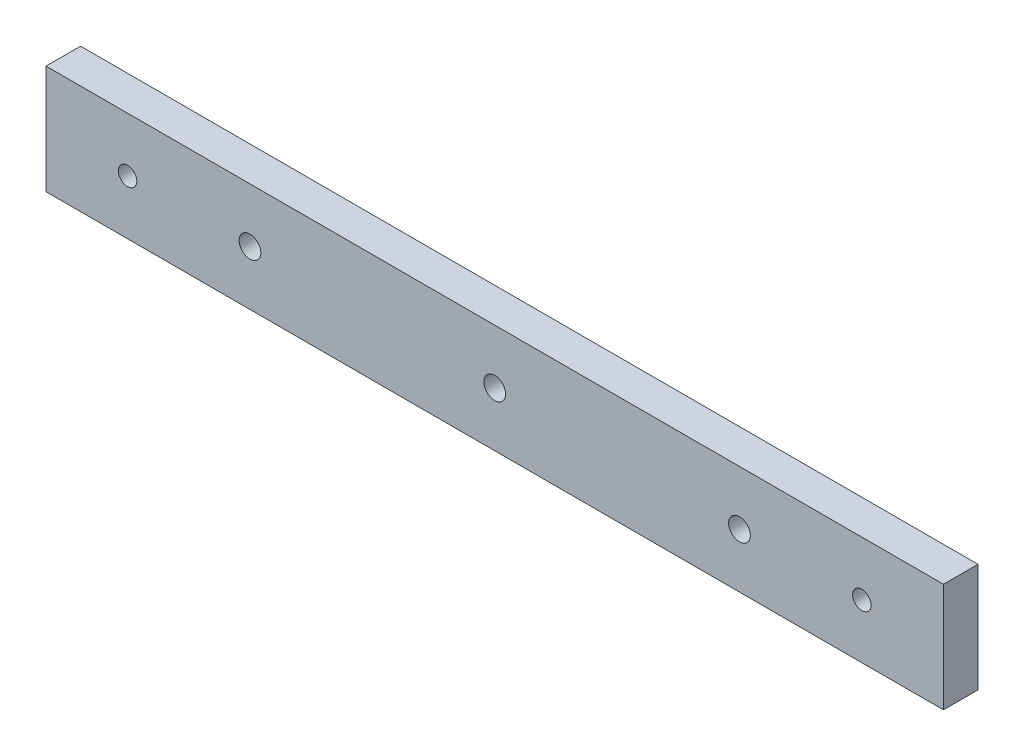
ISO-10303-21;
HEADER;
FILE_DESCRIPTION(('STEP AP214'),'2;1');
FILE_NAME('part.step','',(''),(''),'','','');
FILE_SCHEMA(('AUTOMOTIVE_DESIGN { 1 0 10303 214 1 1 1 1 }'));
ENDSEC;
DATA;
#1=APPLICATION_CONTEXT('core data for automotive mechanical design processes');
#2=APPLICATION_PROTOCOL_DEFINITION('international standard','automotive_design',2000,#1);
#3=PRODUCT_CONTEXT('',#1,'mechanical');
#4=PRODUCT('Part','Part','',(#3));
#5=PRODUCT_RELATED_PRODUCT_CATEGORY('part','',(#4));
#6=PRODUCT_DEFINITION_FORMATION('','',#4);
#7=PRODUCT_DEFINITION_CONTEXT('part definition',#1,'design');
#8=PRODUCT_DEFINITION('design','',#6,#7);
#9=PRODUCT_DEFINITION_SHAPE('','',#8);
#10=(LENGTH_UNIT() NAMED_UNIT(*) SI_UNIT(.MILLI.,.METRE.));
#11=(NAMED_UNIT(*) PLANE_ANGLE_UNIT() SI_UNIT($,.RADIAN.));
#12=(NAMED_UNIT(*) SI_UNIT($,.STERADIAN.) SOLID_ANGLE_UNIT());
#13=UNCERTAINTY_MEASURE_WITH_UNIT(LENGTH_MEASURE(1.E-05),#10,'distance_accuracy_value','');
#14=(GEOMETRIC_REPRESENTATION_CONTEXT(3) GLOBAL_UNCERTAINTY_ASSIGNED_CONTEXT((#13)) GLOBAL_UNIT_ASSIGNED_CONTEXT((#10,
#11,#12)) REPRESENTATION_CONTEXT('',''));
#15=CARTESIAN_POINT('',(0.,0.,0.));
#16=DIRECTION('',(0.,0.,1.));
#17=DIRECTION('',(1.,0.,0.));
#18=AXIS2_PLACEMENT_3D('',#15,#16,#17);
#19=CARTESIAN_POINT('',(29.5476930648458,0.,6.35));
#20=DIRECTION('',(1.,0.,0.));
#21=DIRECTION('',(0.,1.,0.));
#22=AXIS2_PLACEMENT_3D('',#19,#20,#21);
#23=PLANE('',#22);
#24=DIRECTION('',(0.,-1.,0.));
#25=VECTOR('',#24,1.);
#26=CARTESIAN_POINT('',(29.5476930648458,0.,0.));
#27=LINE('',#26,#25);
#28=CARTESIAN_POINT('',(29.5476930648458,-2.57538448919228,0.));
#29=VERTEX_POINT('',#28);
#30=CARTESIAN_POINT('',(29.5476930648458,-22.5753844891923,0.));
#31=VERTEX_POINT('',#30);
#32=EDGE_CURVE('E272',#29,#31,#27,.T.);
#33=ORIENTED_EDGE('',*,*,#32,.F.);
#34=DIRECTION('',(0.,0.,-1.));
#35=VECTOR('',#34,1.);
#36=CARTESIAN_POINT('',(29.5476930648458,-2.57538448919228,6.35));
#37=LINE('',#36,#35);
#38=CARTESIAN_POINT('',(29.5476930648458,-2.57538448919228,6.35));
#39=VERTEX_POINT('',#38);
#40=EDGE_CURVE('E11',#39,#29,#37,.T.);
#41=ORIENTED_EDGE('',*,*,#40,.F.);
#42=DIRECTION('',(0.,-1.,0.));
#43=VECTOR('',#42,1.);
#44=CARTESIAN_POINT('',(29.5476930648458,0.,6.35));
#45=LINE('',#44,#43);
#46=CARTESIAN_POINT('',(29.5476930648458,-22.5753844891923,6.35));
#47=VERTEX_POINT('',#46);
#48=EDGE_CURVE('E255',#39,#47,#45,.T.);
#49=ORIENTED_EDGE('',*,*,#48,.T.);
#50=DIRECTION('',(0.,0.,-1.));
#51=VECTOR('',#50,1.);
#52=CARTESIAN_POINT('',(29.5476930648458,-22.5753844891923,6.35));
#53=LINE('',#52,#51);
#54=EDGE_CURVE('E266',#47,#31,#53,.T.);
#55=ORIENTED_EDGE('',*,*,#54,.T.);
#56=EDGE_LOOP('',(#33,#41,#49,#55));
#57=FACE_BOUND('',#56,.T.);
#58=ADVANCED_FACE('F34',(#57),#23,.T.);
#59=CARTESIAN_POINT('',(0.,-2.57538448919228,6.35));
#60=DIRECTION('',(0.,1.,0.));
#61=DIRECTION('',(-1.,0.,0.));
#62=AXIS2_PLACEMENT_3D('',#59,#60,#61);
#63=PLANE('',#62);
#64=DIRECTION('',(1.,0.,0.));
#65=VECTOR('',#64,1.);
#66=CARTESIAN_POINT('',(0.,-2.57538448919228,0.));
#67=LINE('',#66,#65);
#68=CARTESIAN_POINT('',(-135.452306935154,-2.57538448919231,0.));
#69=VERTEX_POINT('',#68);
#70=EDGE_CURVE('E275',#69,#29,#67,.T.);
#71=ORIENTED_EDGE('',*,*,#70,.F.);
#72=DIRECTION('',(0.,0.,-1.));
#73=VECTOR('',#72,1.);
#74=CARTESIAN_POINT('',(-135.452306935154,-2.57538448919231,6.35));
#75=LINE('',#74,#73);
#76=CARTESIAN_POINT('',(-135.452306935154,-2.57538448919231,6.35));
#77=VERTEX_POINT('',#76);
#78=EDGE_CURVE('E42',#77,#69,#75,.T.);
#79=ORIENTED_EDGE('',*,*,#78,.F.);
#80=DIRECTION('',(1.,0.,0.));
#81=VECTOR('',#80,1.);
#82=CARTESIAN_POINT('',(0.,-2.57538448919228,6.35));
#83=LINE('',#82,#81);
#84=EDGE_CURVE('E258',#77,#39,#83,.T.);
#85=ORIENTED_EDGE('',*,*,#84,.T.);
#86=ORIENTED_EDGE('',*,*,#40,.T.);
#87=EDGE_LOOP('',(#71,#79,#85,#86));
#88=FACE_BOUND('',#87,.T.);
#89=ADVANCED_FACE('F296',(#88),#63,.T.);
#90=CARTESIAN_POINT('',(-135.452306935154,0.,6.35));
#91=DIRECTION('',(1.,0.,0.));
#92=DIRECTION('',(0.,0.,-1.));
#93=AXIS2_PLACEMENT_3D('',#90,#91,#92);
#94=PLANE('',#93);
#95=DIRECTION('',(0.,-1.,0.));
#96=VECTOR('',#95,1.);
#97=CARTESIAN_POINT('',(-135.452306935154,0.,0.));
#98=LINE('',#97,#96);
#99=CARTESIAN_POINT('',(-135.452306935154,-22.5753844891923,0.));
#100=VERTEX_POINT('',#99);
#101=EDGE_CURVE('E278',#69,#100,#98,.T.);
#102=ORIENTED_EDGE('',*,*,#101,.T.);
#103=DIRECTION('',(0.,0.,-1.));
#104=VECTOR('',#103,1.);
#105=CARTESIAN_POINT('',(-135.452306935154,-22.5753844891923,6.35));
#106=LINE('',#105,#104);
#107=CARTESIAN_POINT('',(-135.452306935154,-22.5753844891923,6.35));
#108=VERTEX_POINT('',#107);
#109=EDGE_CURVE('E284',#108,#100,#106,.T.);
#110=ORIENTED_EDGE('',*,*,#109,.F.);
#111=DIRECTION('',(0.,-1.,0.));
#112=VECTOR('',#111,1.);
#113=CARTESIAN_POINT('',(-135.452306935154,0.,6.35));
#114=LINE('',#113,#112);
#115=EDGE_CURVE('E261',#77,#108,#114,.T.);
#116=ORIENTED_EDGE('',*,*,#115,.F.);
#117=ORIENTED_EDGE('',*,*,#78,.T.);
#118=EDGE_LOOP('',(#102,#110,#116,#117));
#119=FACE_BOUND('',#118,.T.);
#120=ADVANCED_FACE('F289',(#119),#94,.F.);
#121=CARTESIAN_POINT('',(14.5476930648458,-12.5753844891923,6.35));
#122=DIRECTION('',(0.,0.,-1.));
#123=DIRECTION('',(-1.,0.,0.));
#124=AXIS2_PLACEMENT_3D('',#121,#122,#123);
#125=CYLINDRICAL_SURFACE('',#124,1.7);
#126=CARTESIAN_POINT('',(14.5476930648458,-12.5753844891923,6.35));
#127=DIRECTION('',(0.,0.,1.));
#128=DIRECTION('',(1.,0.,0.));
#129=AXIS2_PLACEMENT_3D('',#126,#127,#128);
#130=CIRCLE('',#129,1.7);
#131=CARTESIAN_POINT('',(16.2476930648458,-12.5753844891923,6.35));
#132=VERTEX_POINT('',#131);
#133=EDGE_CURVE('E251',#132,#132,#130,.T.);
#134=ORIENTED_EDGE('',*,*,#133,.T.);
#135=EDGE_LOOP('',(#134));
#136=FACE_BOUND('',#135,.T.);
#137=CARTESIAN_POINT('',(14.5476930648458,-12.5753844891923,0.));
#138=DIRECTION('',(0.,0.,1.));
#139=DIRECTION('',(1.,0.,0.));
#140=AXIS2_PLACEMENT_3D('',#137,#138,#139);
#141=CIRCLE('',#140,1.7);
#142=CARTESIAN_POINT('',(16.2476930648458,-12.5753844891923,0.));
#143=VERTEX_POINT('',#142);
#144=EDGE_CURVE('E269',#143,#143,#141,.T.);
#145=ORIENTED_EDGE('',*,*,#144,.F.);
#146=EDGE_LOOP('',(#145));
#147=FACE_BOUND('',#146,.T.);
#148=ADVANCED_FACE('F328',(#136,#147),#125,.F.);
#149=CARTESIAN_POINT('',(-120.452306935154,-12.5753844891923,6.35));
#150=DIRECTION('',(0.,0.,-1.));
#151=DIRECTION('',(-1.,0.,0.));
#152=AXIS2_PLACEMENT_3D('',#149,#150,#151);
#153=CYLINDRICAL_SURFACE('',#152,1.7);
#154=CARTESIAN_POINT('',(-120.452306935154,-12.5753844891923,6.35));
#155=DIRECTION('',(0.,0.,1.));
#156=DIRECTION('',(1.,0.,0.));
#157=AXIS2_PLACEMENT_3D('',#154,#155,#156);
#158=CIRCLE('',#157,1.7);
#159=CARTESIAN_POINT('',(-118.752306935154,-12.5753844891923,6.35));
#160=VERTEX_POINT('',#159);
#161=EDGE_CURVE('E248',#160,#160,#158,.T.);
#162=ORIENTED_EDGE('',*,*,#161,.T.);
#163=EDGE_LOOP('',(#162));
#164=FACE_BOUND('',#163,.T.);
#165=CARTESIAN_POINT('',(-120.452306935154,-12.5753844891923,0.));
#166=DIRECTION('',(0.,0.,1.));
#167=DIRECTION('',(1.,0.,0.));
#168=AXIS2_PLACEMENT_3D('',#165,#166,#167);
#169=CIRCLE('',#168,1.7);
#170=CARTESIAN_POINT('',(-118.752306935154,-12.5753844891923,0.));
#171=VERTEX_POINT('',#170);
#172=EDGE_CURVE('E183',#171,#171,#169,.T.);
#173=ORIENTED_EDGE('',*,*,#172,.F.);
#174=EDGE_LOOP('',(#173));
#175=FACE_BOUND('',#174,.T.);
#176=ADVANCED_FACE('F36',(#164,#175),#153,.F.);
#177=CARTESIAN_POINT('',(0.,-22.5753844891923,6.35));
#178=DIRECTION('',(0.,1.,0.));
#179=DIRECTION('',(0.,0.,1.));
#180=AXIS2_PLACEMENT_3D('',#177,#178,#179);
#181=PLANE('',#180);
#182=DIRECTION('',(1.,0.,0.));
#183=VECTOR('',#182,1.);
#184=CARTESIAN_POINT('',(0.,-22.5753844891923,0.));
#185=LINE('',#184,#183);
#186=EDGE_CURVE('E252',#100,#31,#185,.T.);
#187=ORIENTED_EDGE('',*,*,#186,.T.);
#188=ORIENTED_EDGE('',*,*,#54,.F.);
#189=DIRECTION('',(1.,0.,0.));
#190=VECTOR('',#189,1.);
#191=CARTESIAN_POINT('',(0.,-22.5753844891923,6.35));
#192=LINE('',#191,#190);
#193=EDGE_CURVE('E264',#108,#47,#192,.T.);
#194=ORIENTED_EDGE('',*,*,#193,.F.);
#195=ORIENTED_EDGE('',*,*,#109,.T.);
#196=EDGE_LOOP('',(#187,#188,#194,#195));
#197=FACE_BOUND('',#196,.T.);
#198=ADVANCED_FACE('F302',(#197),#181,.F.);
#199=CARTESIAN_POINT('',(0.,0.,6.35));
#200=DIRECTION('',(0.,0.,1.));
#201=DIRECTION('',(1.,0.,0.));
#202=AXIS2_PLACEMENT_3D('',#199,#200,#201);
#203=PLANE('',#202);
#204=CARTESIAN_POINT('',(-7.95230693515423,-12.5753844891923,6.35));
#205=DIRECTION('',(0.,0.,-1.));
#206=DIRECTION('',(-1.,0.,0.));
#207=AXIS2_PLACEMENT_3D('',#204,#205,#206);
#208=CIRCLE('',#207,2.);
#209=CARTESIAN_POINT('',(-9.95230693515423,-12.5753844891923,6.35));
#210=VERTEX_POINT('',#209);
#211=EDGE_CURVE('E227',#210,#210,#208,.T.);
#212=ORIENTED_EDGE('',*,*,#211,.T.);
#213=EDGE_LOOP('',(#212));
#214=FACE_BOUND('',#213,.T.);
#215=CARTESIAN_POINT('',(-52.9523069351542,-12.5753844891923,6.35));
#216=DIRECTION('',(0.,0.,-1.));
#217=DIRECTION('',(-1.,0.,0.));
#218=AXIS2_PLACEMENT_3D('',#215,#216,#217);
#219=CIRCLE('',#218,2.);
#220=CARTESIAN_POINT('',(-54.9523069351542,-12.5753844891923,6.35));
#221=VERTEX_POINT('',#220);
#222=EDGE_CURVE('E540',#221,#221,#219,.T.);
#223=ORIENTED_EDGE('',*,*,#222,.T.);
#224=EDGE_LOOP('',(#223));
#225=FACE_BOUND('',#224,.T.);
#226=CARTESIAN_POINT('',(-97.9523069351542,-12.5753844891923,6.35));
#227=DIRECTION('',(0.,0.,-1.));
#228=DIRECTION('',(-1.,0.,0.));
#229=AXIS2_PLACEMENT_3D('',#226,#227,#228);
#230=CIRCLE('',#229,2.);
#231=CARTESIAN_POINT('',(-99.9523069351542,-12.5753844891923,6.35));
#232=VERTEX_POINT('',#231);
#233=EDGE_CURVE('E548',#232,#232,#230,.T.);
#234=ORIENTED_EDGE('',*,*,#233,.T.);
#235=EDGE_LOOP('',(#234));
#236=FACE_BOUND('',#235,.T.);
#237=ORIENTED_EDGE('',*,*,#161,.F.);
#238=EDGE_LOOP('',(#237));
#239=FACE_BOUND('',#238,.T.);
#240=ORIENTED_EDGE('',*,*,#133,.F.);
#241=EDGE_LOOP('',(#240));
#242=FACE_BOUND('',#241,.T.);
#243=ORIENTED_EDGE('',*,*,#48,.F.);
#244=ORIENTED_EDGE('',*,*,#84,.F.);
#245=ORIENTED_EDGE('',*,*,#115,.T.);
#246=ORIENTED_EDGE('',*,*,#193,.T.);
#247=EDGE_LOOP('',(#243,#244,#245,#246));
#248=FACE_BOUND('',#247,.T.);
#249=ADVANCED_FACE('F304',(#214,#225,#236,#239,#242,#248),#203,.T.);
#250=CARTESIAN_POINT('',(0.,0.,0.));
#251=DIRECTION('',(0.,0.,1.));
#252=DIRECTION('',(1.,0.,0.));
#253=AXIS2_PLACEMENT_3D('',#250,#251,#252);
#254=PLANE('',#253);
#255=DIRECTION('',(1.,0.,0.));
#256=VECTOR('',#255,1.);
#257=CARTESIAN_POINT('',(-101.502306935154,-9.0253844891923,0.));
#258=LINE('',#257,#256);
#259=CARTESIAN_POINT('',(-101.502306935154,-9.0253844891923,0.));
#260=VERTEX_POINT('',#259);
#261=CARTESIAN_POINT('',(-94.4023069351542,-9.0253844891923,0.));
#262=VERTEX_POINT('',#261);
#263=EDGE_CURVE('E177',#260,#262,#258,.T.);
#264=ORIENTED_EDGE('',*,*,#263,.F.);
#265=CARTESIAN_POINT('',(-101.502306935154,-12.5753844891923,0.));
#266=DIRECTION('',(0.,0.,-1.));
#267=DIRECTION('',(-1.,0.,0.));
#268=AXIS2_PLACEMENT_3D('',#265,#266,#267);
#269=CIRCLE('',#268,3.55);
#270=CARTESIAN_POINT('',(-101.502306935154,-16.1253844891923,0.));
#271=VERTEX_POINT('',#270);
#272=EDGE_CURVE('E49',#271,#260,#269,.T.);
#273=ORIENTED_EDGE('',*,*,#272,.F.);
#274=DIRECTION('',(1.,0.,0.));
#275=VECTOR('',#274,1.);
#276=CARTESIAN_POINT('',(-101.502306935154,-16.1253844891923,0.));
#277=LINE('',#276,#275);
#278=CARTESIAN_POINT('',(-94.4023069351542,-16.1253844891923,0.));
#279=VERTEX_POINT('',#278);
#280=EDGE_CURVE('E165',#271,#279,#277,.T.);
#281=ORIENTED_EDGE('',*,*,#280,.T.);
#282=CARTESIAN_POINT('',(-94.4023069351542,-12.5753844891923,0.));
#283=DIRECTION('',(0.,0.,-1.));
#284=DIRECTION('',(-1.,0.,0.));
#285=AXIS2_PLACEMENT_3D('',#282,#283,#284);
#286=CIRCLE('',#285,3.54999999999999);
#287=EDGE_CURVE('E168',#262,#279,#286,.T.);
#288=ORIENTED_EDGE('',*,*,#287,.F.);
#289=EDGE_LOOP('',(#264,#273,#281,#288));
#290=FACE_BOUND('',#289,.T.);
#291=DIRECTION('',(1.,0.,0.));
#292=VECTOR('',#291,1.);
#293=CARTESIAN_POINT('',(-56.5023069351542,-9.0253844891923,0.));
#294=LINE('',#293,#292);
#295=CARTESIAN_POINT('',(-56.5023069351542,-9.0253844891923,0.));
#296=VERTEX_POINT('',#295);
#297=CARTESIAN_POINT('',(-49.4023069351542,-9.0253844891923,0.));
#298=VERTEX_POINT('',#297);
#299=EDGE_CURVE('E204',#296,#298,#294,.T.);
#300=ORIENTED_EDGE('',*,*,#299,.F.);
#301=CARTESIAN_POINT('',(-56.5023069351542,-12.5753844891923,0.));
#302=DIRECTION('',(0.,0.,-1.));
#303=DIRECTION('',(-1.,0.,0.));
#304=AXIS2_PLACEMENT_3D('',#301,#302,#303);
#305=CIRCLE('',#304,3.55000000000001);
#306=CARTESIAN_POINT('',(-56.5023069351542,-16.1253844891923,0.));
#307=VERTEX_POINT('',#306);
#308=EDGE_CURVE('E57',#307,#296,#305,.T.);
#309=ORIENTED_EDGE('',*,*,#308,.F.);
#310=DIRECTION('',(1.,0.,0.));
#311=VECTOR('',#310,1.);
#312=CARTESIAN_POINT('',(-56.5023069351542,-16.1253844891923,0.));
#313=LINE('',#312,#311);
#314=CARTESIAN_POINT('',(-49.4023069351542,-16.1253844891923,0.));
#315=VERTEX_POINT('',#314);
#316=EDGE_CURVE('E197',#307,#315,#313,.T.);
#317=ORIENTED_EDGE('',*,*,#316,.T.);
#318=CARTESIAN_POINT('',(-49.4023069351542,-12.5753844891923,0.));
#319=DIRECTION('',(0.,0.,-1.));
#320=DIRECTION('',(-1.,0.,0.));
#321=AXIS2_PLACEMENT_3D('',#318,#319,#320);
#322=CIRCLE('',#321,3.55);
#323=EDGE_CURVE('E200',#298,#315,#322,.T.);
#324=ORIENTED_EDGE('',*,*,#323,.F.);
#325=EDGE_LOOP('',(#300,#309,#317,#324));
#326=FACE_BOUND('',#325,.T.);
#327=DIRECTION('',(1.,0.,0.));
#328=VECTOR('',#327,1.);
#329=CARTESIAN_POINT('',(-11.5023069351542,-9.02538448919231,0.));
#330=LINE('',#329,#328);
#331=CARTESIAN_POINT('',(-11.5023069351542,-9.02538448919231,0.));
#332=VERTEX_POINT('',#331);
#333=CARTESIAN_POINT('',(-4.40230693515423,-9.02538448919231,0.));
#334=VERTEX_POINT('',#333);
#335=EDGE_CURVE('E235',#332,#334,#330,.T.);
#336=ORIENTED_EDGE('',*,*,#335,.F.);
#337=CARTESIAN_POINT('',(-11.5023069351542,-12.5753844891923,0.));
#338=DIRECTION('',(0.,0.,-1.));
#339=DIRECTION('',(-1.,0.,0.));
#340=AXIS2_PLACEMENT_3D('',#337,#338,#339);
#341=CIRCLE('',#340,3.55);
#342=CARTESIAN_POINT('',(-11.5023069351542,-16.1253844891923,0.));
#343=VERTEX_POINT('',#342);
#344=EDGE_CURVE('E196',#343,#332,#341,.T.);
#345=ORIENTED_EDGE('',*,*,#344,.F.);
#346=DIRECTION('',(1.,0.,0.));
#347=VECTOR('',#346,1.);
#348=CARTESIAN_POINT('',(-11.5023069351542,-16.1253844891923,0.));
#349=LINE('',#348,#347);
#350=CARTESIAN_POINT('',(-4.40230693515423,-16.1253844891923,0.));
#351=VERTEX_POINT('',#350);
#352=EDGE_CURVE('E228',#343,#351,#349,.T.);
#353=ORIENTED_EDGE('',*,*,#352,.T.);
#354=CARTESIAN_POINT('',(-4.40230693515423,-12.5753844891923,0.));
#355=DIRECTION('',(0.,0.,-1.));
#356=DIRECTION('',(-1.,0.,0.));
#357=AXIS2_PLACEMENT_3D('',#354,#355,#356);
#358=CIRCLE('',#357,3.55);
#359=EDGE_CURVE('E231',#334,#351,#358,.T.);
#360=ORIENTED_EDGE('',*,*,#359,.F.);
#361=EDGE_LOOP('',(#336,#345,#353,#360));
#362=FACE_BOUND('',#361,.T.);
#363=ORIENTED_EDGE('',*,*,#172,.T.);
#364=EDGE_LOOP('',(#363));
#365=FACE_BOUND('',#364,.T.);
#366=ORIENTED_EDGE('',*,*,#144,.T.);
#367=EDGE_LOOP('',(#366));
#368=FACE_BOUND('',#367,.T.);
#369=ORIENTED_EDGE('',*,*,#32,.T.);
#370=ORIENTED_EDGE('',*,*,#186,.F.);
#371=ORIENTED_EDGE('',*,*,#101,.F.);
#372=ORIENTED_EDGE('',*,*,#70,.T.);
#373=EDGE_LOOP('',(#369,#370,#371,#372));
#374=FACE_BOUND('',#373,.T.);
#375=ADVANCED_FACE('F295',(#290,#326,#362,#365,#368,#374),#254,.F.);
#376=CARTESIAN_POINT('',(-11.5023069351542,-12.5753844891923,3.35));
#377=DIRECTION('',(0.,0.,-1.));
#378=DIRECTION('',(-1.,0.,0.));
#379=AXIS2_PLACEMENT_3D('',#376,#377,#378);
#380=CYLINDRICAL_SURFACE('',#379,3.55);
#381=ORIENTED_EDGE('',*,*,#344,.T.);
#382=DIRECTION('',(0.,0.,-1.));
#383=VECTOR('',#382,1.);
#384=CARTESIAN_POINT('',(-11.5023069351542,-9.02538448919231,3.35));
#385=LINE('',#384,#383);
#386=CARTESIAN_POINT('',(-11.5023069351542,-9.02538448919231,3.35));
#387=VERTEX_POINT('',#386);
#388=EDGE_CURVE('E217',#387,#332,#385,.T.);
#389=ORIENTED_EDGE('',*,*,#388,.F.);
#390=CARTESIAN_POINT('',(-11.5023069351542,-12.5753844891923,3.35));
#391=DIRECTION('',(0.,0.,-1.));
#392=DIRECTION('',(-1.,0.,0.));
#393=AXIS2_PLACEMENT_3D('',#390,#391,#392);
#394=CIRCLE('',#393,3.55);
#395=CARTESIAN_POINT('',(-11.5023069351542,-16.1253844891923,3.35));
#396=VERTEX_POINT('',#395);
#397=EDGE_CURVE('E232',#396,#387,#394,.T.);
#398=ORIENTED_EDGE('',*,*,#397,.F.);
#399=DIRECTION('',(0.,0.,-1.));
#400=VECTOR('',#399,1.);
#401=CARTESIAN_POINT('',(-11.5023069351542,-16.1253844891923,3.35));
#402=LINE('',#401,#400);
#403=EDGE_CURVE('E225',#396,#343,#402,.T.);
#404=ORIENTED_EDGE('',*,*,#403,.T.);
#405=EDGE_LOOP('',(#381,#389,#398,#404));
#406=FACE_BOUND('',#405,.T.);
#407=ADVANCED_FACE('F313',(#406),#380,.F.);
#408=CARTESIAN_POINT('',(-11.5023069351542,-16.1253844891923,3.35));
#409=DIRECTION('',(0.,1.,0.));
#410=DIRECTION('',(0.,0.,1.));
#411=AXIS2_PLACEMENT_3D('',#408,#409,#410);
#412=PLANE('',#411);
#413=ORIENTED_EDGE('',*,*,#352,.F.);
#414=ORIENTED_EDGE('',*,*,#403,.F.);
#415=DIRECTION('',(1.,0.,0.));
#416=VECTOR('',#415,1.);
#417=CARTESIAN_POINT('',(-11.5023069351542,-16.1253844891923,3.35));
#418=LINE('',#417,#416);
#419=CARTESIAN_POINT('',(-4.40230693515423,-16.1253844891923,3.35));
#420=VERTEX_POINT('',#419);
#421=EDGE_CURVE('E220',#396,#420,#418,.T.);
#422=ORIENTED_EDGE('',*,*,#421,.T.);
#423=DIRECTION('',(0.,0.,-1.));
#424=VECTOR('',#423,1.);
#425=CARTESIAN_POINT('',(-4.40230693515423,-16.1253844891923,3.35));
#426=LINE('',#425,#424);
#427=EDGE_CURVE('E223',#420,#351,#426,.T.);
#428=ORIENTED_EDGE('',*,*,#427,.T.);
#429=EDGE_LOOP('',(#413,#414,#422,#428));
#430=FACE_BOUND('',#429,.T.);
#431=ADVANCED_FACE('F386',(#430),#412,.T.);
#432=CARTESIAN_POINT('',(-4.40230693515423,-12.5753844891923,3.35));
#433=DIRECTION('',(0.,0.,-1.));
#434=DIRECTION('',(-1.,0.,0.));
#435=AXIS2_PLACEMENT_3D('',#432,#433,#434);
#436=CYLINDRICAL_SURFACE('',#435,3.55);
#437=ORIENTED_EDGE('',*,*,#359,.T.);
#438=ORIENTED_EDGE('',*,*,#427,.F.);
#439=CARTESIAN_POINT('',(-4.40230693515423,-12.5753844891923,3.35));
#440=DIRECTION('',(0.,0.,-1.));
#441=DIRECTION('',(-1.,0.,0.));
#442=AXIS2_PLACEMENT_3D('',#439,#440,#441);
#443=CIRCLE('',#442,3.55);
#444=CARTESIAN_POINT('',(-4.40230693515423,-9.02538448919231,3.35));
#445=VERTEX_POINT('',#444);
#446=EDGE_CURVE('E240',#445,#420,#443,.T.);
#447=ORIENTED_EDGE('',*,*,#446,.F.);
#448=DIRECTION('',(0.,0.,-1.));
#449=VECTOR('',#448,1.);
#450=CARTESIAN_POINT('',(-4.40230693515423,-9.02538448919231,3.35));
#451=LINE('',#450,#449);
#452=EDGE_CURVE('E221',#445,#334,#451,.T.);
#453=ORIENTED_EDGE('',*,*,#452,.T.);
#454=EDGE_LOOP('',(#437,#438,#447,#453));
#455=FACE_BOUND('',#454,.T.);
#456=ADVANCED_FACE('F395',(#455),#436,.F.);
#457=CARTESIAN_POINT('',(-11.5023069351542,-9.02538448919231,3.35));
#458=DIRECTION('',(0.,1.,0.));
#459=DIRECTION('',(-1.,0.,0.));
#460=AXIS2_PLACEMENT_3D('',#457,#458,#459);
#461=PLANE('',#460);
#462=ORIENTED_EDGE('',*,*,#335,.T.);
#463=ORIENTED_EDGE('',*,*,#452,.F.);
#464=DIRECTION('',(1.,0.,0.));
#465=VECTOR('',#464,1.);
#466=CARTESIAN_POINT('',(-11.5023069351542,-9.02538448919231,3.35));
#467=LINE('',#466,#465);
#468=EDGE_CURVE('E243',#387,#445,#467,.T.);
#469=ORIENTED_EDGE('',*,*,#468,.F.);
#470=ORIENTED_EDGE('',*,*,#388,.T.);
#471=EDGE_LOOP('',(#462,#463,#469,#470));
#472=FACE_BOUND('',#471,.T.);
#473=ADVANCED_FACE('F404',(#472),#461,.F.);
#474=CARTESIAN_POINT('',(-11.5023069351542,-12.5753844891923,3.35));
#475=DIRECTION('',(0.,0.,-1.));
#476=DIRECTION('',(-1.,0.,0.));
#477=AXIS2_PLACEMENT_3D('',#474,#475,#476);
#478=PLANE('',#477);
#479=CARTESIAN_POINT('',(-7.95230693515423,-12.5753844891923,3.35));
#480=DIRECTION('',(0.,0.,-1.));
#481=DIRECTION('',(-1.,0.,0.));
#482=AXIS2_PLACEMENT_3D('',#479,#480,#481);
#483=CIRCLE('',#482,2.);
#484=CARTESIAN_POINT('',(-9.95230693515423,-12.5753844891923,3.35));
#485=VERTEX_POINT('',#484);
#486=EDGE_CURVE('E539',#485,#485,#483,.T.);
#487=ORIENTED_EDGE('',*,*,#486,.F.);
#488=EDGE_LOOP('',(#487));
#489=FACE_BOUND('',#488,.T.);
#490=ORIENTED_EDGE('',*,*,#397,.T.);
#491=ORIENTED_EDGE('',*,*,#468,.T.);
#492=ORIENTED_EDGE('',*,*,#446,.T.);
#493=ORIENTED_EDGE('',*,*,#421,.F.);
#494=EDGE_LOOP('',(#490,#491,#492,#493));
#495=FACE_BOUND('',#494,.T.);
#496=ADVANCED_FACE('F413',(#489,#495),#478,.T.);
#497=CARTESIAN_POINT('',(-56.5023069351542,-12.5753844891923,3.35));
#498=DIRECTION('',(0.,0.,-1.));
#499=DIRECTION('',(-1.,0.,0.));
#500=AXIS2_PLACEMENT_3D('',#497,#498,#499);
#501=CYLINDRICAL_SURFACE('',#500,3.55000000000001);
#502=ORIENTED_EDGE('',*,*,#308,.T.);
#503=DIRECTION('',(0.,0.,-1.));
#504=VECTOR('',#503,1.);
#505=CARTESIAN_POINT('',(-56.5023069351542,-9.0253844891923,3.35));
#506=LINE('',#505,#504);
#507=CARTESIAN_POINT('',(-56.5023069351542,-9.0253844891923,3.35));
#508=VERTEX_POINT('',#507);
#509=EDGE_CURVE('E187',#508,#296,#506,.T.);
#510=ORIENTED_EDGE('',*,*,#509,.F.);
#511=CARTESIAN_POINT('',(-56.5023069351542,-12.5753844891923,3.35));
#512=DIRECTION('',(0.,0.,-1.));
#513=DIRECTION('',(-1.,0.,0.));
#514=AXIS2_PLACEMENT_3D('',#511,#512,#513);
#515=CIRCLE('',#514,3.55000000000001);
#516=CARTESIAN_POINT('',(-56.5023069351542,-16.1253844891923,3.35));
#517=VERTEX_POINT('',#516);
#518=EDGE_CURVE('E201',#517,#508,#515,.T.);
#519=ORIENTED_EDGE('',*,*,#518,.F.);
#520=DIRECTION('',(0.,0.,-1.));
#521=VECTOR('',#520,1.);
#522=CARTESIAN_POINT('',(-56.5023069351542,-16.1253844891923,3.35));
#523=LINE('',#522,#521);
#524=EDGE_CURVE('E194',#517,#307,#523,.T.);
#525=ORIENTED_EDGE('',*,*,#524,.T.);
#526=EDGE_LOOP('',(#502,#510,#519,#525));
#527=FACE_BOUND('',#526,.T.);
#528=ADVANCED_FACE('F422',(#527),#501,.F.);
#529=CARTESIAN_POINT('',(-56.5023069351542,-16.1253844891923,3.35));
#530=DIRECTION('',(0.,1.,0.));
#531=DIRECTION('',(0.,0.,1.));
#532=AXIS2_PLACEMENT_3D('',#529,#530,#531);
#533=PLANE('',#532);
#534=ORIENTED_EDGE('',*,*,#316,.F.);
#535=ORIENTED_EDGE('',*,*,#524,.F.);
#536=DIRECTION('',(1.,0.,0.));
#537=VECTOR('',#536,1.);
#538=CARTESIAN_POINT('',(-56.5023069351542,-16.1253844891923,3.35));
#539=LINE('',#538,#537);
#540=CARTESIAN_POINT('',(-49.4023069351542,-16.1253844891923,3.35));
#541=VERTEX_POINT('',#540);
#542=EDGE_CURVE('E189',#517,#541,#539,.T.);
#543=ORIENTED_EDGE('',*,*,#542,.T.);
#544=DIRECTION('',(0.,0.,-1.));
#545=VECTOR('',#544,1.);
#546=CARTESIAN_POINT('',(-49.4023069351542,-16.1253844891923,3.35));
#547=LINE('',#546,#545);
#548=EDGE_CURVE('E192',#541,#315,#547,.T.);
#549=ORIENTED_EDGE('',*,*,#548,.T.);
#550=EDGE_LOOP('',(#534,#535,#543,#549));
#551=FACE_BOUND('',#550,.T.);
#552=ADVANCED_FACE('F429',(#551),#533,.T.);
#553=CARTESIAN_POINT('',(-49.4023069351542,-12.5753844891923,3.35));
#554=DIRECTION('',(0.,0.,-1.));
#555=DIRECTION('',(-1.,0.,0.));
#556=AXIS2_PLACEMENT_3D('',#553,#554,#555);
#557=CYLINDRICAL_SURFACE('',#556,3.55);
#558=ORIENTED_EDGE('',*,*,#323,.T.);
#559=ORIENTED_EDGE('',*,*,#548,.F.);
#560=CARTESIAN_POINT('',(-49.4023069351542,-12.5753844891923,3.35));
#561=DIRECTION('',(0.,0.,-1.));
#562=DIRECTION('',(-1.,0.,0.));
#563=AXIS2_PLACEMENT_3D('',#560,#561,#562);
#564=CIRCLE('',#563,3.55);
#565=CARTESIAN_POINT('',(-49.4023069351542,-9.0253844891923,3.35));
#566=VERTEX_POINT('',#565);
#567=EDGE_CURVE('E209',#566,#541,#564,.T.);
#568=ORIENTED_EDGE('',*,*,#567,.F.);
#569=DIRECTION('',(0.,0.,-1.));
#570=VECTOR('',#569,1.);
#571=CARTESIAN_POINT('',(-49.4023069351542,-9.0253844891923,3.35));
#572=LINE('',#571,#570);
#573=EDGE_CURVE('E190',#566,#298,#572,.T.);
#574=ORIENTED_EDGE('',*,*,#573,.T.);
#575=EDGE_LOOP('',(#558,#559,#568,#574));
#576=FACE_BOUND('',#575,.T.);
#577=ADVANCED_FACE('F437',(#576),#557,.F.);
#578=CARTESIAN_POINT('',(-56.5023069351542,-9.0253844891923,3.35));
#579=DIRECTION('',(0.,1.,0.));
#580=DIRECTION('',(-1.,0.,0.));
#581=AXIS2_PLACEMENT_3D('',#578,#579,#580);
#582=PLANE('',#581);
#583=ORIENTED_EDGE('',*,*,#299,.T.);
#584=ORIENTED_EDGE('',*,*,#573,.F.);
#585=DIRECTION('',(1.,0.,0.));
#586=VECTOR('',#585,1.);
#587=CARTESIAN_POINT('',(-56.5023069351542,-9.0253844891923,3.35));
#588=LINE('',#587,#586);
#589=EDGE_CURVE('E212',#508,#566,#588,.T.);
#590=ORIENTED_EDGE('',*,*,#589,.F.);
#591=ORIENTED_EDGE('',*,*,#509,.T.);
#592=EDGE_LOOP('',(#583,#584,#590,#591));
#593=FACE_BOUND('',#592,.T.);
#594=ADVANCED_FACE('F446',(#593),#582,.F.);
#595=CARTESIAN_POINT('',(-56.5023069351542,-12.5753844891923,3.35));
#596=DIRECTION('',(0.,0.,-1.));
#597=DIRECTION('',(-1.,0.,0.));
#598=AXIS2_PLACEMENT_3D('',#595,#596,#597);
#599=PLANE('',#598);
#600=CARTESIAN_POINT('',(-52.9523069351542,-12.5753844891923,3.35));
#601=DIRECTION('',(0.,0.,-1.));
#602=DIRECTION('',(-1.,0.,0.));
#603=AXIS2_PLACEMENT_3D('',#600,#601,#602);
#604=CIRCLE('',#603,2.);
#605=CARTESIAN_POINT('',(-54.9523069351542,-12.5753844891923,3.35));
#606=VERTEX_POINT('',#605);
#607=EDGE_CURVE('E544',#606,#606,#604,.T.);
#608=ORIENTED_EDGE('',*,*,#607,.F.);
#609=EDGE_LOOP('',(#608));
#610=FACE_BOUND('',#609,.T.);
#611=ORIENTED_EDGE('',*,*,#518,.T.);
#612=ORIENTED_EDGE('',*,*,#589,.T.);
#613=ORIENTED_EDGE('',*,*,#567,.T.);
#614=ORIENTED_EDGE('',*,*,#542,.F.);
#615=EDGE_LOOP('',(#611,#612,#613,#614));
#616=FACE_BOUND('',#615,.T.);
#617=ADVANCED_FACE('F455',(#610,#616),#599,.T.);
#618=CARTESIAN_POINT('',(-101.502306935154,-12.5753844891923,3.35));
#619=DIRECTION('',(0.,0.,-1.));
#620=DIRECTION('',(-1.,0.,0.));
#621=AXIS2_PLACEMENT_3D('',#618,#619,#620);
#622=CYLINDRICAL_SURFACE('',#621,3.55);
#623=ORIENTED_EDGE('',*,*,#272,.T.);
#624=DIRECTION('',(0.,0.,-1.));
#625=VECTOR('',#624,1.);
#626=CARTESIAN_POINT('',(-101.502306935154,-9.0253844891923,3.35));
#627=LINE('',#626,#625);
#628=CARTESIAN_POINT('',(-101.502306935154,-9.0253844891923,3.35));
#629=VERTEX_POINT('',#628);
#630=EDGE_CURVE('E144',#629,#260,#627,.T.);
#631=ORIENTED_EDGE('',*,*,#630,.F.);
#632=CARTESIAN_POINT('',(-101.502306935154,-12.5753844891923,3.35));
#633=DIRECTION('',(0.,0.,-1.));
#634=DIRECTION('',(-1.,0.,0.));
#635=AXIS2_PLACEMENT_3D('',#632,#633,#634);
#636=CIRCLE('',#635,3.55);
#637=CARTESIAN_POINT('',(-101.502306935154,-16.1253844891923,3.35));
#638=VERTEX_POINT('',#637);
#639=EDGE_CURVE('E148',#638,#629,#636,.T.);
#640=ORIENTED_EDGE('',*,*,#639,.F.);
#641=DIRECTION('',(0.,0.,-1.));
#642=VECTOR('',#641,1.);
#643=CARTESIAN_POINT('',(-101.502306935154,-16.1253844891923,3.35));
#644=LINE('',#643,#642);
#645=EDGE_CURVE('E181',#638,#271,#644,.T.);
#646=ORIENTED_EDGE('',*,*,#645,.T.);
#647=EDGE_LOOP('',(#623,#631,#640,#646));
#648=FACE_BOUND('',#647,.T.);
#649=ADVANCED_FACE('F146',(#648),#622,.F.);
#650=CARTESIAN_POINT('',(-101.502306935154,-16.1253844891923,3.35));
#651=DIRECTION('',(0.,1.,0.));
#652=DIRECTION('',(0.,0.,1.));
#653=AXIS2_PLACEMENT_3D('',#650,#651,#652);
#654=PLANE('',#653);
#655=ORIENTED_EDGE('',*,*,#280,.F.);
#656=ORIENTED_EDGE('',*,*,#645,.F.);
#657=DIRECTION('',(1.,0.,0.));
#658=VECTOR('',#657,1.);
#659=CARTESIAN_POINT('',(-101.502306935154,-16.1253844891923,3.35));
#660=LINE('',#659,#658);
#661=CARTESIAN_POINT('',(-94.4023069351542,-16.1253844891923,3.35));
#662=VERTEX_POINT('',#661);
#663=EDGE_CURVE('E153',#638,#662,#660,.T.);
#664=ORIENTED_EDGE('',*,*,#663,.T.);
#665=DIRECTION('',(0.,0.,-1.));
#666=VECTOR('',#665,1.);
#667=CARTESIAN_POINT('',(-94.4023069351542,-16.1253844891923,3.35));
#668=LINE('',#667,#666);
#669=EDGE_CURVE('E184',#662,#279,#668,.T.);
#670=ORIENTED_EDGE('',*,*,#669,.T.);
#671=EDGE_LOOP('',(#655,#656,#664,#670));
#672=FACE_BOUND('',#671,.T.);
#673=ADVANCED_FACE('F472',(#672),#654,.T.);
#674=CARTESIAN_POINT('',(-94.4023069351542,-12.5753844891923,3.35));
#675=DIRECTION('',(0.,0.,-1.));
#676=DIRECTION('',(-1.,0.,0.));
#677=AXIS2_PLACEMENT_3D('',#674,#675,#676);
#678=CYLINDRICAL_SURFACE('',#677,3.54999999999999);
#679=ORIENTED_EDGE('',*,*,#287,.T.);
#680=ORIENTED_EDGE('',*,*,#669,.F.);
#681=CARTESIAN_POINT('',(-94.4023069351542,-12.5753844891923,3.35));
#682=DIRECTION('',(0.,0.,-1.));
#683=DIRECTION('',(-1.,0.,0.));
#684=AXIS2_PLACEMENT_3D('',#681,#682,#683);
#685=CIRCLE('',#684,3.54999999999999);
#686=CARTESIAN_POINT('',(-94.4023069351542,-9.0253844891923,3.35));
#687=VERTEX_POINT('',#686);
#688=EDGE_CURVE('E161',#687,#662,#685,.T.);
#689=ORIENTED_EDGE('',*,*,#688,.F.);
#690=DIRECTION('',(0.,0.,-1.));
#691=VECTOR('',#690,1.);
#692=CARTESIAN_POINT('',(-94.4023069351542,-9.0253844891923,3.35));
#693=LINE('',#692,#691);
#694=EDGE_CURVE('E152',#687,#262,#693,.T.);
#695=ORIENTED_EDGE('',*,*,#694,.T.);
#696=EDGE_LOOP('',(#679,#680,#689,#695));
#697=FACE_BOUND('',#696,.T.);
#698=ADVANCED_FACE('F480',(#697),#678,.F.);
#699=CARTESIAN_POINT('',(-101.502306935154,-9.0253844891923,3.35));
#700=DIRECTION('',(0.,1.,0.));
#701=DIRECTION('',(-1.,0.,0.));
#702=AXIS2_PLACEMENT_3D('',#699,#700,#701);
#703=PLANE('',#702);
#704=ORIENTED_EDGE('',*,*,#263,.T.);
#705=ORIENTED_EDGE('',*,*,#694,.F.);
#706=DIRECTION('',(1.,0.,0.));
#707=VECTOR('',#706,1.);
#708=CARTESIAN_POINT('',(-101.502306935154,-9.0253844891923,3.35));
#709=LINE('',#708,#707);
#710=EDGE_CURVE('E156',#629,#687,#709,.T.);
#711=ORIENTED_EDGE('',*,*,#710,.F.);
#712=ORIENTED_EDGE('',*,*,#630,.T.);
#713=EDGE_LOOP('',(#704,#705,#711,#712));
#714=FACE_BOUND('',#713,.T.);
#715=ADVANCED_FACE('F157',(#714),#703,.F.);
#716=CARTESIAN_POINT('',(-101.502306935154,-12.5753844891923,3.35));
#717=DIRECTION('',(0.,0.,-1.));
#718=DIRECTION('',(-1.,0.,0.));
#719=AXIS2_PLACEMENT_3D('',#716,#717,#718);
#720=PLANE('',#719);
#721=CARTESIAN_POINT('',(-97.9523069351542,-12.5753844891923,3.35));
#722=DIRECTION('',(0.,0.,-1.));
#723=DIRECTION('',(-1.,0.,0.));
#724=AXIS2_PLACEMENT_3D('',#721,#722,#723);
#725=CIRCLE('',#724,2.);
#726=CARTESIAN_POINT('',(-99.9523069351542,-12.5753844891923,3.35));
#727=VERTEX_POINT('',#726);
#728=EDGE_CURVE('E171',#727,#727,#725,.T.);
#729=ORIENTED_EDGE('',*,*,#728,.F.);
#730=EDGE_LOOP('',(#729));
#731=FACE_BOUND('',#730,.T.);
#732=ORIENTED_EDGE('',*,*,#639,.T.);
#733=ORIENTED_EDGE('',*,*,#710,.T.);
#734=ORIENTED_EDGE('',*,*,#688,.T.);
#735=ORIENTED_EDGE('',*,*,#663,.F.);
#736=EDGE_LOOP('',(#732,#733,#734,#735));
#737=FACE_BOUND('',#736,.T.);
#738=ADVANCED_FACE('F164',(#731,#737),#720,.T.);
#739=CARTESIAN_POINT('',(-97.9523069351542,-12.5753844891923,6.35));
#740=DIRECTION('',(0.,0.,-1.));
#741=DIRECTION('',(-1.,0.,0.));
#742=AXIS2_PLACEMENT_3D('',#739,#740,#741);
#743=CYLINDRICAL_SURFACE('',#742,2.);
#744=ORIENTED_EDGE('',*,*,#233,.F.);
#745=EDGE_LOOP('',(#744));
#746=FACE_BOUND('',#745,.T.);
#747=ORIENTED_EDGE('',*,*,#728,.T.);
#748=EDGE_LOOP('',(#747));
#749=FACE_BOUND('',#748,.T.);
#750=ADVANCED_FACE('F503',(#746,#749),#743,.F.);
#751=CARTESIAN_POINT('',(-52.9523069351542,-12.5753844891923,6.35));
#752=DIRECTION('',(0.,0.,-1.));
#753=DIRECTION('',(-1.,0.,0.));
#754=AXIS2_PLACEMENT_3D('',#751,#752,#753);
#755=CYLINDRICAL_SURFACE('',#754,2.);
#756=ORIENTED_EDGE('',*,*,#222,.F.);
#757=EDGE_LOOP('',(#756));
#758=FACE_BOUND('',#757,.T.);
#759=ORIENTED_EDGE('',*,*,#607,.T.);
#760=EDGE_LOOP('',(#759));
#761=FACE_BOUND('',#760,.T.);
#762=ADVANCED_FACE('F512',(#758,#761),#755,.F.);
#763=CARTESIAN_POINT('',(-7.95230693515423,-12.5753844891923,6.35));
#764=DIRECTION('',(0.,0.,-1.));
#765=DIRECTION('',(-1.,0.,0.));
#766=AXIS2_PLACEMENT_3D('',#763,#764,#765);
#767=CYLINDRICAL_SURFACE('',#766,2.);
#768=ORIENTED_EDGE('',*,*,#211,.F.);
#769=EDGE_LOOP('',(#768));
#770=FACE_BOUND('',#769,.T.);
#771=ORIENTED_EDGE('',*,*,#486,.T.);
#772=EDGE_LOOP('',(#771));
#773=FACE_BOUND('',#772,.T.);
#774=ADVANCED_FACE('F521',(#770,#773),#767,.F.);
#775=CLOSED_SHELL('',(#58,#89,#120,#148,#176,#198,#249,#375,#407,#431,#456,#473,#496,#528,#552,
#577,#594,#617,#649,#673,#698,#715,#738,#750,#762,#774));
#776=MANIFOLD_SOLID_BREP('B2',#775);
#777=ADVANCED_BREP_SHAPE_REPRESENTATION('',(#18,#776),#14);
#778=SHAPE_DEFINITION_REPRESENTATION(#9,#777);
ENDSEC;
END-ISO-10303-21;
